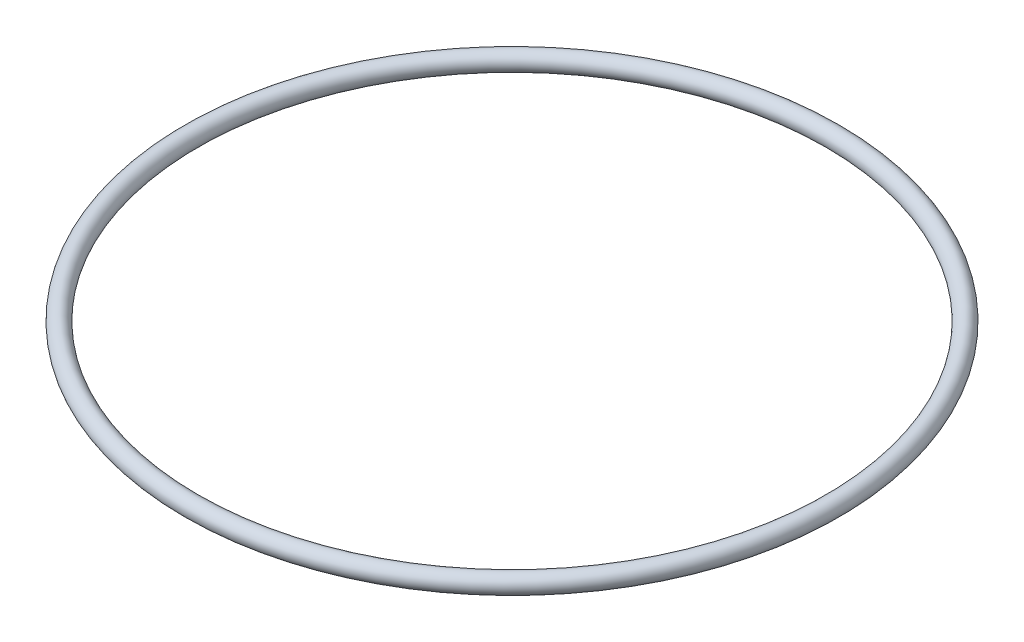
ISO-10303-21;
HEADER;
FILE_DESCRIPTION(('STEP AP214'),'2;1');
FILE_NAME('part.step','',(''),(''),'','','');
FILE_SCHEMA(('AUTOMOTIVE_DESIGN { 1 0 10303 214 1 1 1 1 }'));
ENDSEC;
DATA;
#1=APPLICATION_CONTEXT('core data for automotive mechanical design processes');
#2=APPLICATION_PROTOCOL_DEFINITION('international standard','automotive_design',2000,#1);
#3=PRODUCT_CONTEXT('',#1,'mechanical');
#4=PRODUCT('Part','Part','',(#3));
#5=PRODUCT_RELATED_PRODUCT_CATEGORY('part','',(#4));
#6=PRODUCT_DEFINITION_FORMATION('','',#4);
#7=PRODUCT_DEFINITION_CONTEXT('part definition',#1,'design');
#8=PRODUCT_DEFINITION('design','',#6,#7);
#9=PRODUCT_DEFINITION_SHAPE('','',#8);
#10=(LENGTH_UNIT() NAMED_UNIT(*) SI_UNIT(.MILLI.,.METRE.));
#11=(NAMED_UNIT(*) PLANE_ANGLE_UNIT() SI_UNIT($,.RADIAN.));
#12=(NAMED_UNIT(*) SI_UNIT($,.STERADIAN.) SOLID_ANGLE_UNIT());
#13=UNCERTAINTY_MEASURE_WITH_UNIT(LENGTH_MEASURE(1.E-05),#10,'distance_accuracy_value','');
#14=(GEOMETRIC_REPRESENTATION_CONTEXT(3) GLOBAL_UNCERTAINTY_ASSIGNED_CONTEXT((#13)) GLOBAL_UNIT_ASSIGNED_CONTEXT((#10,
#11,#12)) REPRESENTATION_CONTEXT('',''));
#15=CARTESIAN_POINT('',(0.,0.,0.));
#16=DIRECTION('',(0.,0.,1.));
#17=DIRECTION('',(1.,0.,0.));
#18=AXIS2_PLACEMENT_3D('',#15,#16,#17);
#19=CARTESIAN_POINT('',(0.,0.,0.));
#20=DIRECTION('',(0.,-1.,0.));
#21=DIRECTION('',(0.,0.,-1.));
#22=AXIS2_PLACEMENT_3D('',#19,#20,#21);
#23=TOROIDAL_SURFACE('',#22,35.,0.999999999999998);
#24=CARTESIAN_POINT('',(0.,0.,-36.));
#25=VERTEX_POINT('',#24);
#26=VERTEX_LOOP('',#25);
#27=FACE_BOUND('',#26,.T.);
#28=ADVANCED_FACE('F28',(#27),#23,.T.);
#29=CLOSED_SHELL('',(#28));
#30=MANIFOLD_SOLID_BREP('B2',#29);
#31=ADVANCED_BREP_SHAPE_REPRESENTATION('',(#18,#30),#14);
#32=SHAPE_DEFINITION_REPRESENTATION(#9,#31);
ENDSEC;
END-ISO-10303-21;
